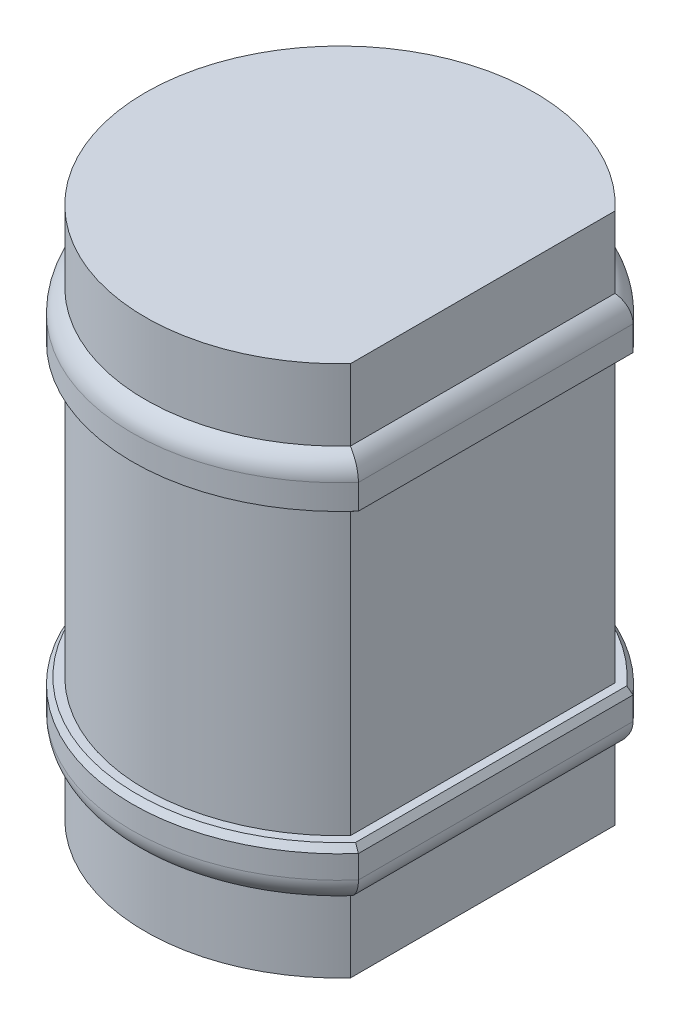
ISO-10303-21;
HEADER;
FILE_DESCRIPTION(('STEP AP214'),'2;1');
FILE_NAME('part.step','',(''),(''),'','','');
FILE_SCHEMA(('AUTOMOTIVE_DESIGN { 1 0 10303 214 1 1 1 1 }'));
ENDSEC;
DATA;
#1=APPLICATION_CONTEXT('core data for automotive mechanical design processes');
#2=APPLICATION_PROTOCOL_DEFINITION('international standard','automotive_design',2000,#1);
#3=PRODUCT_CONTEXT('',#1,'mechanical');
#4=PRODUCT('Part','Part','',(#3));
#5=PRODUCT_RELATED_PRODUCT_CATEGORY('part','',(#4));
#6=PRODUCT_DEFINITION_FORMATION('','',#4);
#7=PRODUCT_DEFINITION_CONTEXT('part definition',#1,'design');
#8=PRODUCT_DEFINITION('design','',#6,#7);
#9=PRODUCT_DEFINITION_SHAPE('','',#8);
#10=(LENGTH_UNIT() NAMED_UNIT(*) SI_UNIT(.MILLI.,.METRE.));
#11=(NAMED_UNIT(*) PLANE_ANGLE_UNIT() SI_UNIT($,.RADIAN.));
#12=(NAMED_UNIT(*) SI_UNIT($,.STERADIAN.) SOLID_ANGLE_UNIT());
#13=UNCERTAINTY_MEASURE_WITH_UNIT(LENGTH_MEASURE(1.E-05),#10,'distance_accuracy_value','');
#14=(GEOMETRIC_REPRESENTATION_CONTEXT(3) GLOBAL_UNCERTAINTY_ASSIGNED_CONTEXT((#13)) GLOBAL_UNIT_ASSIGNED_CONTEXT((#10,
#11,#12)) REPRESENTATION_CONTEXT('',''));
#15=CARTESIAN_POINT('',(0.,0.,0.));
#16=DIRECTION('',(0.,0.,1.));
#17=DIRECTION('',(1.,0.,0.));
#18=AXIS2_PLACEMENT_3D('',#15,#16,#17);
#19=CARTESIAN_POINT('',(5.5,10.25,-5.09901951359279));
#20=DIRECTION('',(1.,0.,0.));
#21=DIRECTION('',(0.,0.,-1.));
#22=AXIS2_PLACEMENT_3D('',#19,#20,#21);
#23=PLANE('',#22);
#24=DIRECTION('',(0.,0.,1.));
#25=VECTOR('',#24,1.);
#26=CARTESIAN_POINT('',(5.5,7.5,-5.09901951359279));
#27=LINE('',#26,#25);
#28=CARTESIAN_POINT('',(5.5,7.5,-5.09901951359279));
#29=VERTEX_POINT('',#28);
#30=CARTESIAN_POINT('',(5.5,7.5,5.09901951359278));
#31=VERTEX_POINT('',#30);
#32=EDGE_CURVE('E316',#29,#31,#27,.T.);
#33=ORIENTED_EDGE('',*,*,#32,.F.);
#34=DIRECTION('',(0.,-1.,0.));
#35=VECTOR('',#34,1.);
#36=CARTESIAN_POINT('',(5.5,10.25,-5.09901951359279));
#37=LINE('',#36,#35);
#38=CARTESIAN_POINT('',(5.5,10.25,-5.09901951359279));
#39=VERTEX_POINT('',#38);
#40=EDGE_CURVE('E168',#39,#29,#37,.T.);
#41=ORIENTED_EDGE('',*,*,#40,.F.);
#42=DIRECTION('',(0.,0.,1.));
#43=VECTOR('',#42,1.);
#44=CARTESIAN_POINT('',(5.5,10.25,-5.09901951359279));
#45=LINE('',#44,#43);
#46=CARTESIAN_POINT('',(5.5,10.25,5.09901951359278));
#47=VERTEX_POINT('',#46);
#48=EDGE_CURVE('E320',#39,#47,#45,.T.);
#49=ORIENTED_EDGE('',*,*,#48,.T.);
#50=DIRECTION('',(0.,-1.,0.));
#51=VECTOR('',#50,1.);
#52=CARTESIAN_POINT('',(5.5,10.25,5.09901951359278));
#53=LINE('',#52,#51);
#54=EDGE_CURVE('E166',#47,#31,#53,.T.);
#55=ORIENTED_EDGE('',*,*,#54,.T.);
#56=EDGE_LOOP('',(#33,#41,#49,#55));
#57=FACE_BOUND('',#56,.T.);
#58=ADVANCED_FACE('F45',(#57),#23,.T.);
#59=CARTESIAN_POINT('',(0.,10.25,0.));
#60=DIRECTION('',(0.,-1.,0.));
#61=DIRECTION('',(0.,0.,-1.));
#62=AXIS2_PLACEMENT_3D('',#59,#60,#61);
#63=CYLINDRICAL_SURFACE('',#62,7.5);
#64=ORIENTED_EDGE('',*,*,#40,.T.);
#65=CARTESIAN_POINT('',(0.,7.5,0.));
#66=DIRECTION('',(0.,1.,0.));
#67=DIRECTION('',(0.,0.,1.));
#68=AXIS2_PLACEMENT_3D('',#65,#66,#67);
#69=CIRCLE('',#68,7.5);
#70=EDGE_CURVE('E178',#29,#31,#69,.T.);
#71=ORIENTED_EDGE('',*,*,#70,.T.);
#72=ORIENTED_EDGE('',*,*,#54,.F.);
#73=CARTESIAN_POINT('',(0.,10.25,0.));
#74=DIRECTION('',(0.,1.,0.));
#75=DIRECTION('',(0.,0.,1.));
#76=AXIS2_PLACEMENT_3D('',#73,#74,#75);
#77=CIRCLE('',#76,7.5);
#78=EDGE_CURVE('E324',#39,#47,#77,.T.);
#79=ORIENTED_EDGE('',*,*,#78,.F.);
#80=EDGE_LOOP('',(#64,#71,#72,#79));
#81=FACE_BOUND('',#80,.T.);
#82=ADVANCED_FACE('F260',(#81),#63,.T.);
#83=CARTESIAN_POINT('',(0.,10.25,0.));
#84=DIRECTION('',(0.,1.,0.));
#85=DIRECTION('',(0.,0.,1.));
#86=AXIS2_PLACEMENT_3D('',#83,#84,#85);
#87=PLANE('',#86);
#88=ORIENTED_EDGE('',*,*,#48,.F.);
#89=ORIENTED_EDGE('',*,*,#78,.T.);
#90=EDGE_LOOP('',(#88,#89));
#91=FACE_BOUND('',#90,.T.);
#92=ADVANCED_FACE('F267',(#91),#87,.T.);
#93=CARTESIAN_POINT('',(0.,5.5,0.));
#94=DIRECTION('',(0.,1.,0.));
#95=DIRECTION('',(0.,0.,1.));
#96=AXIS2_PLACEMENT_3D('',#93,#94,#95);
#97=PLANE('',#96);
#98=CARTESIAN_POINT('',(0.,5.5,0.));
#99=DIRECTION('',(0.,1.,0.));
#100=DIRECTION('',(0.,0.,1.));
#101=AXIS2_PLACEMENT_3D('',#98,#99,#100);
#102=CIRCLE('',#101,7.75);
#103=CARTESIAN_POINT('',(5.75,5.5,5.19615242270663));
#104=VERTEX_POINT('',#103);
#105=CARTESIAN_POINT('',(5.75,5.5,-5.19615242270663));
#106=VERTEX_POINT('',#105);
#107=EDGE_CURVE('E395',#104,#106,#102,.F.);
#108=ORIENTED_EDGE('',*,*,#107,.T.);
#109=DIRECTION('',(0.,0.,1.));
#110=VECTOR('',#109,1.);
#111=CARTESIAN_POINT('',(5.75,5.5,0.));
#112=LINE('',#111,#110);
#113=EDGE_CURVE('E388',#106,#104,#112,.T.);
#114=ORIENTED_EDGE('',*,*,#113,.T.);
#115=EDGE_LOOP('',(#108,#114));
#116=FACE_BOUND('',#115,.T.);
#117=DIRECTION('',(0.,0.,1.));
#118=VECTOR('',#117,1.);
#119=CARTESIAN_POINT('',(5.5,5.5,-5.09901951359279));
#120=LINE('',#119,#118);
#121=CARTESIAN_POINT('',(5.5,5.5,-5.09901951359279));
#122=VERTEX_POINT('',#121);
#123=CARTESIAN_POINT('',(5.5,5.5,5.09901951359278));
#124=VERTEX_POINT('',#123);
#125=EDGE_CURVE('E313',#122,#124,#120,.T.);
#126=ORIENTED_EDGE('',*,*,#125,.F.);
#127=CARTESIAN_POINT('',(0.,5.5,0.));
#128=DIRECTION('',(0.,1.,0.));
#129=DIRECTION('',(0.,0.,1.));
#130=AXIS2_PLACEMENT_3D('',#127,#128,#129);
#131=CIRCLE('',#130,7.5);
#132=EDGE_CURVE('E299',#122,#124,#131,.T.);
#133=ORIENTED_EDGE('',*,*,#132,.T.);
#134=EDGE_LOOP('',(#126,#133));
#135=FACE_BOUND('',#134,.T.);
#136=ADVANCED_FACE('F419',(#116,#135),#97,.F.);
#137=CARTESIAN_POINT('',(0.,7.5,0.));
#138=DIRECTION('',(0.,-1.,0.));
#139=DIRECTION('',(0.,0.,-1.));
#140=AXIS2_PLACEMENT_3D('',#137,#138,#139);
#141=CYLINDRICAL_SURFACE('',#140,8.);
#142=DIRECTION('',(0.,-1.,0.));
#143=VECTOR('',#142,1.);
#144=CARTESIAN_POINT('',(6.,7.5,-5.29150262212918));
#145=LINE('',#144,#143);
#146=CARTESIAN_POINT('',(6.,6.63397459621556,-5.29150262212918));
#147=VERTEX_POINT('',#146);
#148=CARTESIAN_POINT('',(6.,5.67505188455243,-5.29150262212918));
#149=VERTEX_POINT('',#148);
#150=EDGE_CURVE('E302',#147,#149,#145,.T.);
#151=ORIENTED_EDGE('',*,*,#150,.T.);
#152=CARTESIAN_POINT('',(0.,5.67505188455243,0.));
#153=DIRECTION('',(0.,1.,0.));
#154=DIRECTION('',(0.,0.,1.));
#155=AXIS2_PLACEMENT_3D('',#152,#153,#154);
#156=CIRCLE('',#155,8.);
#157=CARTESIAN_POINT('',(6.,5.67505188455243,5.29150262212918));
#158=VERTEX_POINT('',#157);
#159=EDGE_CURVE('E384',#149,#158,#156,.T.);
#160=ORIENTED_EDGE('',*,*,#159,.T.);
#161=DIRECTION('',(0.,-1.,0.));
#162=VECTOR('',#161,1.);
#163=CARTESIAN_POINT('',(6.,7.5,5.29150262212918));
#164=LINE('',#163,#162);
#165=CARTESIAN_POINT('',(6.,6.63397459621556,5.29150262212918));
#166=VERTEX_POINT('',#165);
#167=EDGE_CURVE('E306',#166,#158,#164,.T.);
#168=ORIENTED_EDGE('',*,*,#167,.F.);
#169=CARTESIAN_POINT('',(0.,6.63397459621556,0.));
#170=DIRECTION('',(0.,1.,0.));
#171=DIRECTION('',(0.,0.,1.));
#172=AXIS2_PLACEMENT_3D('',#169,#170,#171);
#173=CIRCLE('',#172,8.);
#174=EDGE_CURVE('E344',#166,#147,#173,.F.);
#175=ORIENTED_EDGE('',*,*,#174,.T.);
#176=EDGE_LOOP('',(#151,#160,#168,#175));
#177=FACE_BOUND('',#176,.T.);
#178=ADVANCED_FACE('F382',(#177),#141,.T.);
#179=CARTESIAN_POINT('',(6.,7.5,-5.29150262212918));
#180=DIRECTION('',(-1.,0.,0.));
#181=DIRECTION('',(0.,0.,1.));
#182=AXIS2_PLACEMENT_3D('',#179,#180,#181);
#183=PLANE('',#182);
#184=ORIENTED_EDGE('',*,*,#167,.T.);
#185=DIRECTION('',(0.,0.,-1.));
#186=VECTOR('',#185,1.);
#187=CARTESIAN_POINT('',(6.,5.67505188455243,-5.29150262212918));
#188=LINE('',#187,#186);
#189=EDGE_CURVE('E351',#158,#149,#188,.T.);
#190=ORIENTED_EDGE('',*,*,#189,.T.);
#191=ORIENTED_EDGE('',*,*,#150,.F.);
#192=DIRECTION('',(0.,0.,-1.));
#193=VECTOR('',#192,1.);
#194=CARTESIAN_POINT('',(6.,6.63397459621556,-5.29150262212918));
#195=LINE('',#194,#193);
#196=EDGE_CURVE('E296',#147,#166,#195,.F.);
#197=ORIENTED_EDGE('',*,*,#196,.T.);
#198=EDGE_LOOP('',(#184,#190,#191,#197));
#199=FACE_BOUND('',#198,.T.);
#200=ADVANCED_FACE('F284',(#199),#183,.F.);
#201=CARTESIAN_POINT('',(5.5,-5.5,-5.09901951359279));
#202=VERTEX_POINT('',#201);
#203=EDGE_CURVE('E165',#122,#202,#37,.T.);
#204=ORIENTED_EDGE('',*,*,#203,.T.);
#205=CARTESIAN_POINT('',(0.,-5.5,0.));
#206=DIRECTION('',(0.,1.,0.));
#207=DIRECTION('',(0.,0.,1.));
#208=AXIS2_PLACEMENT_3D('',#205,#206,#207);
#209=CIRCLE('',#208,7.5);
#210=CARTESIAN_POINT('',(5.5,-5.5,5.09901951359279));
#211=VERTEX_POINT('',#210);
#212=EDGE_CURVE('E154',#202,#211,#209,.T.);
#213=ORIENTED_EDGE('',*,*,#212,.T.);
#214=EDGE_CURVE('E291',#124,#211,#53,.T.);
#215=ORIENTED_EDGE('',*,*,#214,.F.);
#216=ORIENTED_EDGE('',*,*,#132,.F.);
#217=EDGE_LOOP('',(#204,#213,#215,#216));
#218=FACE_BOUND('',#217,.T.);
#219=ADVANCED_FACE('F270',(#218),#63,.T.);
#220=DIRECTION('',(0.,0.,1.));
#221=VECTOR('',#220,1.);
#222=CARTESIAN_POINT('',(5.5,-5.5,-5.09901951359279));
#223=LINE('',#222,#221);
#224=EDGE_CURVE('E177',#202,#211,#223,.T.);
#225=ORIENTED_EDGE('',*,*,#224,.F.);
#226=ORIENTED_EDGE('',*,*,#203,.F.);
#227=ORIENTED_EDGE('',*,*,#125,.T.);
#228=ORIENTED_EDGE('',*,*,#214,.T.);
#229=EDGE_LOOP('',(#225,#226,#227,#228));
#230=FACE_BOUND('',#229,.T.);
#231=ADVANCED_FACE('F263',(#230),#23,.T.);
#232=CARTESIAN_POINT('',(0.,-5.5,0.));
#233=DIRECTION('',(0.,1.,0.));
#234=DIRECTION('',(0.,0.,1.));
#235=AXIS2_PLACEMENT_3D('',#232,#233,#234);
#236=PLANE('',#235);
#237=CARTESIAN_POINT('',(0.,-5.5,0.));
#238=DIRECTION('',(0.,1.,0.));
#239=DIRECTION('',(0.,0.,1.));
#240=AXIS2_PLACEMENT_3D('',#237,#238,#239);
#241=CIRCLE('',#240,7.82494811544757);
#242=CARTESIAN_POINT('',(5.82494811544757,-5.5,-5.22492033066441));
#243=VERTEX_POINT('',#242);
#244=CARTESIAN_POINT('',(5.82494811544757,-5.5,5.22492033066441));
#245=VERTEX_POINT('',#244);
#246=EDGE_CURVE('E387',#243,#245,#241,.T.);
#247=ORIENTED_EDGE('',*,*,#246,.T.);
#248=DIRECTION('',(0.,0.,-1.));
#249=VECTOR('',#248,1.);
#250=CARTESIAN_POINT('',(5.82494811544757,-5.5,-5.29150262212918));
#251=LINE('',#250,#249);
#252=EDGE_CURVE('E392',#245,#243,#251,.T.);
#253=ORIENTED_EDGE('',*,*,#252,.T.);
#254=EDGE_LOOP('',(#247,#253));
#255=FACE_BOUND('',#254,.T.);
#256=ORIENTED_EDGE('',*,*,#212,.F.);
#257=ORIENTED_EDGE('',*,*,#224,.T.);
#258=EDGE_LOOP('',(#256,#257));
#259=FACE_BOUND('',#258,.T.);
#260=ADVANCED_FACE('F275',(#255,#259),#236,.T.);
#261=CARTESIAN_POINT('',(6.,-5.5,5.29150262212918));
#262=DIRECTION('',(-1.,0.,0.));
#263=DIRECTION('',(0.,0.,1.));
#264=AXIS2_PLACEMENT_3D('',#261,#262,#263);
#265=PLANE('',#264);
#266=DIRECTION('',(0.,-1.,0.));
#267=VECTOR('',#266,1.);
#268=CARTESIAN_POINT('',(6.,-5.5,-5.29150262212918));
#269=LINE('',#268,#267);
#270=CARTESIAN_POINT('',(6.,-5.75000000000001,-5.29150262212918));
#271=VERTEX_POINT('',#270);
#272=CARTESIAN_POINT('',(6.,-6.63397459621556,-5.29150262212918));
#273=VERTEX_POINT('',#272);
#274=EDGE_CURVE('E155',#271,#273,#269,.T.);
#275=ORIENTED_EDGE('',*,*,#274,.F.);
#276=DIRECTION('',(0.,0.,1.));
#277=VECTOR('',#276,1.);
#278=CARTESIAN_POINT('',(6.,-5.75000000000001,5.29150262212918));
#279=LINE('',#278,#277);
#280=CARTESIAN_POINT('',(6.,-5.75000000000001,5.29150262212918));
#281=VERTEX_POINT('',#280);
#282=EDGE_CURVE('E61',#271,#281,#279,.T.);
#283=ORIENTED_EDGE('',*,*,#282,.T.);
#284=DIRECTION('',(0.,-1.,0.));
#285=VECTOR('',#284,1.);
#286=CARTESIAN_POINT('',(6.,-5.5,5.29150262212918));
#287=LINE('',#286,#285);
#288=CARTESIAN_POINT('',(6.,-6.63397459621556,5.29150262212918));
#289=VERTEX_POINT('',#288);
#290=EDGE_CURVE('E375',#281,#289,#287,.T.);
#291=ORIENTED_EDGE('',*,*,#290,.T.);
#292=DIRECTION('',(0.,0.,-1.));
#293=VECTOR('',#292,1.);
#294=CARTESIAN_POINT('',(6.,-6.63397459621556,5.29150262212918));
#295=LINE('',#294,#293);
#296=EDGE_CURVE('E347',#289,#273,#295,.T.);
#297=ORIENTED_EDGE('',*,*,#296,.T.);
#298=EDGE_LOOP('',(#275,#283,#291,#297));
#299=FACE_BOUND('',#298,.T.);
#300=ADVANCED_FACE('F281',(#299),#265,.F.);
#301=CARTESIAN_POINT('',(0.,-5.5,0.));
#302=DIRECTION('',(0.,-1.,0.));
#303=DIRECTION('',(0.,0.,-1.));
#304=AXIS2_PLACEMENT_3D('',#301,#302,#303);
#305=CYLINDRICAL_SURFACE('',#304,8.);
#306=ORIENTED_EDGE('',*,*,#290,.F.);
#307=CARTESIAN_POINT('',(0.,-5.75000000000001,0.));
#308=DIRECTION('',(0.,1.,0.));
#309=DIRECTION('',(0.,0.,1.));
#310=AXIS2_PLACEMENT_3D('',#307,#308,#309);
#311=CIRCLE('',#310,8.);
#312=EDGE_CURVE('E11',#281,#271,#311,.F.);
#313=ORIENTED_EDGE('',*,*,#312,.T.);
#314=ORIENTED_EDGE('',*,*,#274,.T.);
#315=CARTESIAN_POINT('',(0.,-6.63397459621556,0.));
#316=DIRECTION('',(0.,-1.,0.));
#317=DIRECTION('',(0.,0.,-1.));
#318=AXIS2_PLACEMENT_3D('',#315,#316,#317);
#319=CIRCLE('',#318,8.);
#320=EDGE_CURVE('E182',#273,#289,#319,.F.);
#321=ORIENTED_EDGE('',*,*,#320,.T.);
#322=EDGE_LOOP('',(#306,#313,#314,#321));
#323=FACE_BOUND('',#322,.T.);
#324=ADVANCED_FACE('F405',(#323),#305,.T.);
#325=CARTESIAN_POINT('',(0.,-10.25,0.));
#326=DIRECTION('',(0.,1.,0.));
#327=DIRECTION('',(0.,0.,1.));
#328=AXIS2_PLACEMENT_3D('',#325,#326,#327);
#329=PLANE('',#328);
#330=DIRECTION('',(0.,0.,1.));
#331=VECTOR('',#330,1.);
#332=CARTESIAN_POINT('',(5.5,-10.25,-5.09901951359279));
#333=LINE('',#332,#331);
#334=CARTESIAN_POINT('',(5.5,-10.25,-5.09901951359279));
#335=VERTEX_POINT('',#334);
#336=CARTESIAN_POINT('',(5.5,-10.25,5.09901951359278));
#337=VERTEX_POINT('',#336);
#338=EDGE_CURVE('E163',#335,#337,#333,.T.);
#339=ORIENTED_EDGE('',*,*,#338,.T.);
#340=CARTESIAN_POINT('',(0.,-10.25,0.));
#341=DIRECTION('',(0.,1.,0.));
#342=DIRECTION('',(0.,0.,1.));
#343=AXIS2_PLACEMENT_3D('',#340,#341,#342);
#344=CIRCLE('',#343,7.5);
#345=EDGE_CURVE('E325',#335,#337,#344,.T.);
#346=ORIENTED_EDGE('',*,*,#345,.F.);
#347=EDGE_LOOP('',(#339,#346));
#348=FACE_BOUND('',#347,.T.);
#349=ADVANCED_FACE('F273',(#348),#329,.F.);
#350=CARTESIAN_POINT('',(5.5,-7.5,-5.09901951359279));
#351=VERTEX_POINT('',#350);
#352=EDGE_CURVE('E146',#351,#335,#37,.T.);
#353=ORIENTED_EDGE('',*,*,#352,.F.);
#354=DIRECTION('',(0.,0.,1.));
#355=VECTOR('',#354,1.);
#356=CARTESIAN_POINT('',(5.5,-7.5,-5.09901951359279));
#357=LINE('',#356,#355);
#358=CARTESIAN_POINT('',(5.5,-7.5,5.09901951359278));
#359=VERTEX_POINT('',#358);
#360=EDGE_CURVE('E161',#351,#359,#357,.T.);
#361=ORIENTED_EDGE('',*,*,#360,.T.);
#362=EDGE_CURVE('E148',#359,#337,#53,.T.);
#363=ORIENTED_EDGE('',*,*,#362,.T.);
#364=ORIENTED_EDGE('',*,*,#338,.F.);
#365=EDGE_LOOP('',(#353,#361,#363,#364));
#366=FACE_BOUND('',#365,.T.);
#367=ADVANCED_FACE('F160',(#366),#23,.T.);
#368=CARTESIAN_POINT('',(0.,-7.5,0.));
#369=DIRECTION('',(0.,1.,0.));
#370=DIRECTION('',(0.,0.,1.));
#371=AXIS2_PLACEMENT_3D('',#368,#369,#370);
#372=CIRCLE('',#371,7.5);
#373=EDGE_CURVE('E142',#351,#359,#372,.T.);
#374=ORIENTED_EDGE('',*,*,#373,.F.);
#375=ORIENTED_EDGE('',*,*,#352,.T.);
#376=ORIENTED_EDGE('',*,*,#345,.T.);
#377=ORIENTED_EDGE('',*,*,#362,.F.);
#378=EDGE_LOOP('',(#374,#375,#376,#377));
#379=FACE_BOUND('',#378,.T.);
#380=ADVANCED_FACE('F144',(#379),#63,.T.);
#381=CARTESIAN_POINT('',(0.,6.63397459621556,0.));
#382=DIRECTION('',(0.,1.,0.));
#383=DIRECTION('',(0.,0.,1.));
#384=AXIS2_PLACEMENT_3D('',#381,#382,#383);
#385=TOROIDAL_SURFACE('',#384,7.,1.);
#386=CARTESIAN_POINT('',(5.5,7.5,-5.09901951359279));
#387=CARTESIAN_POINT('',(5.54782414768332,7.47244043350956,-5.11777942347439));
#388=CARTESIAN_POINT('',(5.59362568556879,7.44066768627616,-5.1356388871891));
#389=CARTESIAN_POINT('',(5.67985940020292,7.36943444160505,-5.1691115063772));
#390=CARTESIAN_POINT('',(5.72028339501402,7.32996244978128,-5.18472124182908));
#391=CARTESIAN_POINT('',(5.79438508740274,7.24404165145981,-5.21322797283255));
#392=CARTESIAN_POINT('',(5.82804435302563,7.19757437081915,-5.22611756141199));
#393=CARTESIAN_POINT('',(5.88711795961845,7.09907217534241,-5.24867592109829));
#394=CARTESIAN_POINT('',(5.91254618934337,7.04704683840879,-5.25835011848793));
#395=CARTESIAN_POINT('',(5.95510901118132,6.93635346716734,-5.27451472672763));
#396=CARTESIAN_POINT('',(5.97180760457053,6.87748983499177,-5.28083795025338));
#397=CARTESIAN_POINT('',(5.98865205270179,6.7873263079101,-5.28721214167945));
#398=CARTESIAN_POINT('',(5.99289994055211,6.7568439045499,-5.28881853372045));
#399=CARTESIAN_POINT('',(5.99857482594307,6.69557277571098,-5.29096398450924));
#400=CARTESIAN_POINT('',(6.00000111163418,6.66478397490111,-5.29150277391635));
#401=CARTESIAN_POINT('',(6.,6.63397459621556,-5.29150262212918));
#402=B_SPLINE_CURVE_WITH_KNOTS('',3,(#386,#387,#388,#389,#390,#391,#392,#393,#394,#395,#396,
#397,#398,#399,#400,#401),.UNSPECIFIED.,.F.,.F.,(4,2,2,2,2,2,2,4),(0.,0.174772320463023,
0.349807587818827,0.525313496526331,0.700521700138097,0.88380077089388,0.976127608887873,
1.06847773664188),.UNSPECIFIED.);
#403=EDGE_CURVE('E189',#147,#29,#402,.F.);
#404=ORIENTED_EDGE('',*,*,#403,.F.);
#405=ORIENTED_EDGE('',*,*,#174,.F.);
#406=CARTESIAN_POINT('',(6.,6.63397459621556,5.29150262212918));
#407=CARTESIAN_POINT('',(6.00000070117163,6.66077552530148,5.29150273409945));
#408=CARTESIAN_POINT('',(5.9989218112538,6.68756314727372,5.29109512151331));
#409=CARTESIAN_POINT('',(5.99462363542025,6.74093682193932,5.28947024966291));
#410=CARTESIAN_POINT('',(5.99140471724345,6.76752290847046,5.28825312950308));
#411=CARTESIAN_POINT('',(5.97859542543323,6.84654593460288,5.28340730671933));
#412=CARTESIAN_POINT('',(5.96585220788995,6.89843719719447,5.27858404290662));
#413=CARTESIAN_POINT('',(5.93244707695624,6.9991625518562,5.26591188051037));
#414=CARTESIAN_POINT('',(5.91178660434346,7.0479971982877,5.25806353242844));
#415=CARTESIAN_POINT('',(5.8632895478888,7.14142074210572,5.23958426255496));
#416=CARTESIAN_POINT('',(5.83544862015248,7.18600704697397,5.2289516563363));
#417=CARTESIAN_POINT('',(5.77272868654837,7.27096179002397,5.20490757903699));
#418=CARTESIAN_POINT('',(5.73768470685368,7.31118948137014,5.19143072486048));
#419=CARTESIAN_POINT('',(5.66219118833164,7.38516703624048,5.16226461370634));
#420=CARTESIAN_POINT('',(5.62174692012058,7.41892313868552,5.14657751308862));
#421=CARTESIAN_POINT('',(5.5535185359364,7.46741118450865,5.11997812759151));
#422=CARTESIAN_POINT('',(5.5270769829252,7.48437774602052,5.10964040375449));
#423=CARTESIAN_POINT('',(5.5,7.5,5.09901951359279));
#424=B_SPLINE_CURVE_WITH_KNOTS('',3,(#406,#407,#408,#409,#410,#411,#412,#413,#414,#415,#416,
#417,#418,#419,#420,#421,#422,#423),.UNSPECIFIED.,.F.,.F.,(4,2,2,2,2,2,2,2,4),(0.,
0.0803517950855189,0.160689786219394,0.320804565371183,0.480890220751506,0.641072949786943,
0.805443491199388,0.969654765828557,1.06872262595651),.UNSPECIFIED.);
#425=EDGE_CURVE('E200',#31,#166,#424,.F.);
#426=ORIENTED_EDGE('',*,*,#425,.F.);
#427=ORIENTED_EDGE('',*,*,#70,.F.);
#428=EDGE_LOOP('',(#404,#405,#426,#427));
#429=FACE_BOUND('',#428,.T.);
#430=ADVANCED_FACE('F357',(#429),#385,.T.);
#431=CARTESIAN_POINT('',(5.,6.63397459621556,0.));
#432=DIRECTION('',(0.,0.,-1.));
#433=DIRECTION('',(-1.,0.,0.));
#434=AXIS2_PLACEMENT_3D('',#431,#432,#433);
#435=CYLINDRICAL_SURFACE('',#434,1.);
#436=ORIENTED_EDGE('',*,*,#425,.T.);
#437=ORIENTED_EDGE('',*,*,#196,.F.);
#438=ORIENTED_EDGE('',*,*,#403,.T.);
#439=ORIENTED_EDGE('',*,*,#32,.T.);
#440=EDGE_LOOP('',(#436,#437,#438,#439));
#441=FACE_BOUND('',#440,.T.);
#442=ADVANCED_FACE('F359',(#441),#435,.T.);
#443=CARTESIAN_POINT('',(0.,-6.63397459621556,0.));
#444=DIRECTION('',(0.,-1.,0.));
#445=DIRECTION('',(0.,0.,-1.));
#446=AXIS2_PLACEMENT_3D('',#443,#444,#445);
#447=TOROIDAL_SURFACE('',#446,7.,1.);
#448=CARTESIAN_POINT('',(6.,-6.63397459621556,-5.29150262212918));
#449=CARTESIAN_POINT('',(6.00000070117163,-6.66077552530148,-5.29150273409945));
#450=CARTESIAN_POINT('',(5.9989218112538,-6.68756314727373,-5.2910951215133));
#451=CARTESIAN_POINT('',(5.99462363542025,-6.74093682193932,-5.28947024966291));
#452=CARTESIAN_POINT('',(5.99140471724345,-6.76752290847046,-5.28825312950308));
#453=CARTESIAN_POINT('',(5.97859542543323,-6.84654593460288,-5.28340730671933));
#454=CARTESIAN_POINT('',(5.96585220788995,-6.89843719719447,-5.27858404290663));
#455=CARTESIAN_POINT('',(5.93244707695624,-6.9991625518562,-5.26591188051037));
#456=CARTESIAN_POINT('',(5.91178660434346,-7.0479971982877,-5.25806353242844));
#457=CARTESIAN_POINT('',(5.8632895478888,-7.14142074210572,-5.23958426255496));
#458=CARTESIAN_POINT('',(5.83544862015248,-7.18600704697397,-5.22895165633631));
#459=CARTESIAN_POINT('',(5.77272868654837,-7.27096179002397,-5.20490757903699));
#460=CARTESIAN_POINT('',(5.73768470685368,-7.31118948137014,-5.19143072486048));
#461=CARTESIAN_POINT('',(5.66219118833163,-7.38516703624048,-5.16226461370635));
#462=CARTESIAN_POINT('',(5.62174692012058,-7.41892313868552,-5.14657751308863));
#463=CARTESIAN_POINT('',(5.5535185359364,-7.46741118450865,-5.11997812759151));
#464=CARTESIAN_POINT('',(5.5270769829252,-7.48437774602052,-5.1096404037545));
#465=CARTESIAN_POINT('',(5.5,-7.5,-5.09901951359279));
#466=B_SPLINE_CURVE_WITH_KNOTS('',3,(#448,#449,#450,#451,#452,#453,#454,#455,#456,#457,#458,
#459,#460,#461,#462,#463,#464,#465),.UNSPECIFIED.,.F.,.F.,(4,2,2,2,2,2,2,2,4),(0.,
0.0803517950855206,0.160689786219395,0.320804565371183,0.480890220751506,0.641072949786943,
0.805443491199387,0.969654765828556,1.06872262595651),.UNSPECIFIED.);
#467=EDGE_CURVE('E173',#351,#273,#466,.F.);
#468=ORIENTED_EDGE('',*,*,#467,.F.);
#469=ORIENTED_EDGE('',*,*,#373,.T.);
#470=CARTESIAN_POINT('',(5.5,-7.5,5.09901951359278));
#471=CARTESIAN_POINT('',(5.54782414768332,-7.47244043350956,5.11777942347439));
#472=CARTESIAN_POINT('',(5.59362568556879,-7.44066768627615,5.13563888718911));
#473=CARTESIAN_POINT('',(5.67985940020292,-7.36943444160505,5.1691115063772));
#474=CARTESIAN_POINT('',(5.72028339501402,-7.32996244978128,5.18472124182908));
#475=CARTESIAN_POINT('',(5.79438508740274,-7.24404165145981,5.21322797283255));
#476=CARTESIAN_POINT('',(5.82804435302563,-7.19757437081915,5.22611756141199));
#477=CARTESIAN_POINT('',(5.88711795961845,-7.0990721753424,5.24867592109829));
#478=CARTESIAN_POINT('',(5.91254618934337,-7.04704683840878,5.25835011848793));
#479=CARTESIAN_POINT('',(5.95510901118132,-6.93635346716733,5.27451472672763));
#480=CARTESIAN_POINT('',(5.97180760457053,-6.87748983499177,5.28083795025339));
#481=CARTESIAN_POINT('',(5.98865205270179,-6.78732630791009,5.28721214167945));
#482=CARTESIAN_POINT('',(5.99289994055212,-6.7568439045499,5.28881853372045));
#483=CARTESIAN_POINT('',(5.99857482594307,-6.69557277571098,5.29096398450924));
#484=CARTESIAN_POINT('',(6.00000111163418,-6.6647839749011,5.29150277391634));
#485=CARTESIAN_POINT('',(6.,-6.63397459621556,5.29150262212918));
#486=B_SPLINE_CURVE_WITH_KNOTS('',3,(#470,#471,#472,#473,#474,#475,#476,#477,#478,#479,#480,
#481,#482,#483,#484,#485),.UNSPECIFIED.,.F.,.F.,(4,2,2,2,2,2,2,4),(0.,0.174772320463023,
0.349807587818827,0.525313496526332,0.700521700138097,0.883800770893881,0.976127608887875,
1.06847773664188),.UNSPECIFIED.);
#487=EDGE_CURVE('E175',#289,#359,#486,.F.);
#488=ORIENTED_EDGE('',*,*,#487,.F.);
#489=ORIENTED_EDGE('',*,*,#320,.F.);
#490=EDGE_LOOP('',(#468,#469,#488,#489));
#491=FACE_BOUND('',#490,.T.);
#492=ADVANCED_FACE('F180',(#491),#447,.T.);
#493=CARTESIAN_POINT('',(5.,-6.63397459621556,0.));
#494=DIRECTION('',(0.,0.,-1.));
#495=DIRECTION('',(-1.,0.,0.));
#496=AXIS2_PLACEMENT_3D('',#493,#494,#495);
#497=CYLINDRICAL_SURFACE('',#496,1.);
#498=ORIENTED_EDGE('',*,*,#487,.T.);
#499=ORIENTED_EDGE('',*,*,#360,.F.);
#500=ORIENTED_EDGE('',*,*,#467,.T.);
#501=ORIENTED_EDGE('',*,*,#296,.F.);
#502=EDGE_LOOP('',(#498,#499,#500,#501));
#503=FACE_BOUND('',#502,.T.);
#504=ADVANCED_FACE('F171',(#503),#497,.T.);
#505=CARTESIAN_POINT('',(0.,5.67505188455243,0.));
#506=DIRECTION('',(0.,1.,0.));
#507=DIRECTION('',(0.,0.,1.));
#508=AXIS2_PLACEMENT_3D('',#505,#506,#507);
#509=CONICAL_SURFACE('',#508,8.,0.959931088596883);
#510=CARTESIAN_POINT('',(6.,5.67505188455243,-5.29150262212918));
#511=CARTESIAN_POINT('',(5.95829964693374,5.64585298298942,-5.27574255366448));
#512=CARTESIAN_POINT('',(5.91661613762049,5.61666587554925,-5.25991666969317));
#513=CARTESIAN_POINT('',(5.83328280428536,5.55831524736386,-5.22813326989265));
#514=CARTESIAN_POINT('',(5.79163298026528,5.52915172661989,-5.21217575405645));
#515=CARTESIAN_POINT('',(5.75,5.5,-5.19615242270663));
#516=B_SPLINE_CURVE_WITH_KNOTS('',3,(#510,#511,#512,#513,#514,#515),.UNSPECIFIED.,.F.,.F.,(4,2,
4),(0.,0.159871032822682,0.319742074142718),.UNSPECIFIED.);
#517=EDGE_CURVE('E191',#106,#149,#516,.F.);
#518=ORIENTED_EDGE('',*,*,#517,.F.);
#519=ORIENTED_EDGE('',*,*,#107,.F.);
#520=CARTESIAN_POINT('',(5.75,5.5,5.19615242270663));
#521=CARTESIAN_POINT('',(5.79163298026528,5.52915172661989,5.21217575405645));
#522=CARTESIAN_POINT('',(5.83328280428536,5.55831524736386,5.22813326989265));
#523=CARTESIAN_POINT('',(5.91661613762049,5.61666587554925,5.25991666969317));
#524=CARTESIAN_POINT('',(5.95829964693374,5.64585298298942,5.27574255366448));
#525=CARTESIAN_POINT('',(6.,5.67505188455243,5.29150262212918));
#526=B_SPLINE_CURVE_WITH_KNOTS('',3,(#520,#521,#522,#523,#524,#525),.UNSPECIFIED.,.F.,.F.,(4,2,
4),(0.,0.159871041320037,0.319742074142718),.UNSPECIFIED.);
#527=EDGE_CURVE('E185',#158,#104,#526,.F.);
#528=ORIENTED_EDGE('',*,*,#527,.F.);
#529=ORIENTED_EDGE('',*,*,#159,.F.);
#530=EDGE_LOOP('',(#518,#519,#528,#529));
#531=FACE_BOUND('',#530,.T.);
#532=ADVANCED_FACE('F217',(#531),#509,.T.);
#533=CARTESIAN_POINT('',(6.,5.67505188455243,-5.29150262212918));
#534=DIRECTION('',(-0.573576436351044,0.819152044288993,0.));
#535=DIRECTION('',(0.,0.,-1.));
#536=AXIS2_PLACEMENT_3D('',#533,#534,#535);
#537=PLANE('',#536);
#538=ORIENTED_EDGE('',*,*,#527,.T.);
#539=ORIENTED_EDGE('',*,*,#113,.F.);
#540=ORIENTED_EDGE('',*,*,#517,.T.);
#541=ORIENTED_EDGE('',*,*,#189,.F.);
#542=EDGE_LOOP('',(#538,#539,#540,#541));
#543=FACE_BOUND('',#542,.T.);
#544=ADVANCED_FACE('F226',(#543),#537,.F.);
#545=CARTESIAN_POINT('',(0.,-5.5,0.));
#546=DIRECTION('',(0.,-1.,0.));
#547=DIRECTION('',(0.,0.,-1.));
#548=AXIS2_PLACEMENT_3D('',#545,#546,#547);
#549=CONICAL_SURFACE('',#548,7.82494811544757,0.610865238198012);
#550=CARTESIAN_POINT('',(5.82494811544757,-5.5,-5.22492033066441));
#551=CARTESIAN_POINT('',(5.85411503744079,-5.54165468150742,-5.23608444543345));
#552=CARTESIAN_POINT('',(5.88328615555359,-5.58331535569465,-5.24721502713321));
#553=CARTESIAN_POINT('',(5.94163678373781,-5.66664868902811,-5.26940912428749));
#554=CARTESIAN_POINT('',(5.97081629380916,-5.70832134817421,-5.28047263974265));
#555=CARTESIAN_POINT('',(6.,-5.75000000000001,-5.29150262212918));
#556=B_SPLINE_CURVE_WITH_KNOTS('',3,(#550,#551,#552,#553,#554,#555),.UNSPECIFIED.,.F.,.F.,(4,2,
4),(0.,0.156186112673138,0.312372223844523),.UNSPECIFIED.);
#557=EDGE_CURVE('E239',#271,#243,#556,.F.);
#558=ORIENTED_EDGE('',*,*,#557,.F.);
#559=ORIENTED_EDGE('',*,*,#312,.F.);
#560=CARTESIAN_POINT('',(6.,-5.75000000000001,5.29150262212918));
#561=CARTESIAN_POINT('',(5.97081629380916,-5.70832134817421,5.28047263974265));
#562=CARTESIAN_POINT('',(5.94163678373781,-5.66664868902811,5.26940912428749));
#563=CARTESIAN_POINT('',(5.88328615555359,-5.58331535569465,5.24721502713321));
#564=CARTESIAN_POINT('',(5.85411503744079,-5.54165468150742,5.23608444543344));
#565=CARTESIAN_POINT('',(5.82494811544757,-5.5,5.22492033066441));
#566=B_SPLINE_CURVE_WITH_KNOTS('',3,(#560,#561,#562,#563,#564,#565),.UNSPECIFIED.,.F.,.F.,(4,2,
4),(0.,0.156186111171385,0.312372223844523),.UNSPECIFIED.);
#567=EDGE_CURVE('E51',#245,#281,#566,.F.);
#568=ORIENTED_EDGE('',*,*,#567,.F.);
#569=ORIENTED_EDGE('',*,*,#246,.F.);
#570=EDGE_LOOP('',(#558,#559,#568,#569));
#571=FACE_BOUND('',#570,.T.);
#572=ADVANCED_FACE('F246',(#571),#549,.T.);
#573=CARTESIAN_POINT('',(5.82494811544757,-5.5,0.));
#574=DIRECTION('',(0.819152044288993,0.573576436351044,0.));
#575=DIRECTION('',(0.,0.,1.));
#576=AXIS2_PLACEMENT_3D('',#573,#574,#575);
#577=PLANE('',#576);
#578=ORIENTED_EDGE('',*,*,#567,.T.);
#579=ORIENTED_EDGE('',*,*,#282,.F.);
#580=ORIENTED_EDGE('',*,*,#557,.T.);
#581=ORIENTED_EDGE('',*,*,#252,.F.);
#582=EDGE_LOOP('',(#578,#579,#580,#581));
#583=FACE_BOUND('',#582,.T.);
#584=ADVANCED_FACE('F48',(#583),#577,.T.);
#585=CLOSED_SHELL('',(#58,#82,#92,#136,#178,#200,#219,#231,#260,#300,#324,#349,#367,#380,#430,
#442,#492,#504,#532,#544,#572,#584));
#586=MANIFOLD_SOLID_BREP('B2',#585);
#587=ADVANCED_BREP_SHAPE_REPRESENTATION('',(#18,#586),#14);
#588=SHAPE_DEFINITION_REPRESENTATION(#9,#587);
ENDSEC;
END-ISO-10303-21;
